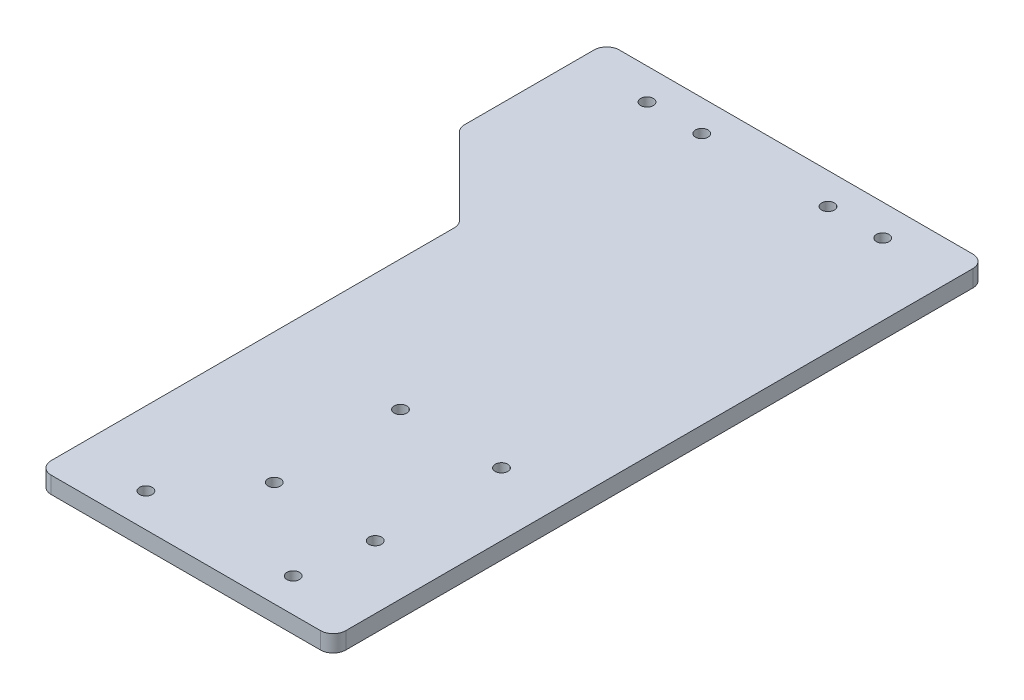
ISO-10303-21;
HEADER;
FILE_DESCRIPTION(('STEP AP214'),'2;1');
FILE_NAME('part.step','',(''),(''),'','','');
FILE_SCHEMA(('AUTOMOTIVE_DESIGN { 1 0 10303 214 1 1 1 1 }'));
ENDSEC;
DATA;
#1=APPLICATION_CONTEXT('core data for automotive mechanical design processes');
#2=APPLICATION_PROTOCOL_DEFINITION('international standard','automotive_design',2000,#1);
#3=PRODUCT_CONTEXT('',#1,'mechanical');
#4=PRODUCT('Part','Part','',(#3));
#5=PRODUCT_RELATED_PRODUCT_CATEGORY('part','',(#4));
#6=PRODUCT_DEFINITION_FORMATION('','',#4);
#7=PRODUCT_DEFINITION_CONTEXT('part definition',#1,'design');
#8=PRODUCT_DEFINITION('design','',#6,#7);
#9=PRODUCT_DEFINITION_SHAPE('','',#8);
#10=(LENGTH_UNIT() NAMED_UNIT(*) SI_UNIT(.MILLI.,.METRE.));
#11=(NAMED_UNIT(*) PLANE_ANGLE_UNIT() SI_UNIT($,.RADIAN.));
#12=(NAMED_UNIT(*) SI_UNIT($,.STERADIAN.) SOLID_ANGLE_UNIT());
#13=UNCERTAINTY_MEASURE_WITH_UNIT(LENGTH_MEASURE(1.E-05),#10,'distance_accuracy_value','');
#14=(GEOMETRIC_REPRESENTATION_CONTEXT(3) GLOBAL_UNCERTAINTY_ASSIGNED_CONTEXT((#13)) GLOBAL_UNIT_ASSIGNED_CONTEXT((#10,
#11,#12)) REPRESENTATION_CONTEXT('',''));
#15=CARTESIAN_POINT('',(0.,0.,0.));
#16=DIRECTION('',(0.,0.,1.));
#17=DIRECTION('',(1.,0.,0.));
#18=AXIS2_PLACEMENT_3D('',#15,#16,#17);
#19=CARTESIAN_POINT('',(0.,4.,0.));
#20=DIRECTION('',(0.,0.,-1.));
#21=DIRECTION('',(-1.,0.,0.));
#22=AXIS2_PLACEMENT_3D('',#19,#20,#21);
#23=PLANE('',#22);
#24=DIRECTION('',(1.,0.,0.));
#25=VECTOR('',#24,1.);
#26=CARTESIAN_POINT('',(0.,0.,0.));
#27=LINE('',#26,#25);
#28=CARTESIAN_POINT('',(-7.,0.,0.));
#29=VERTEX_POINT('',#28);
#30=CARTESIAN_POINT('',(57.,0.,0.));
#31=VERTEX_POINT('',#30);
#32=EDGE_CURVE('E152',#29,#31,#27,.T.);
#33=ORIENTED_EDGE('',*,*,#32,.T.);
#34=DIRECTION('',(0.,-1.,0.));
#35=VECTOR('',#34,1.);
#36=CARTESIAN_POINT('',(57.,4.,0.));
#37=LINE('',#36,#35);
#38=CARTESIAN_POINT('',(57.,4.,0.));
#39=VERTEX_POINT('',#38);
#40=EDGE_CURVE('E129',#31,#39,#37,.F.);
#41=ORIENTED_EDGE('',*,*,#40,.T.);
#42=DIRECTION('',(1.,0.,0.));
#43=VECTOR('',#42,1.);
#44=CARTESIAN_POINT('',(0.,4.,0.));
#45=LINE('',#44,#43);
#46=CARTESIAN_POINT('',(-7.,4.,0.));
#47=VERTEX_POINT('',#46);
#48=EDGE_CURVE('E166',#47,#39,#45,.T.);
#49=ORIENTED_EDGE('',*,*,#48,.F.);
#50=DIRECTION('',(0.,1.,0.));
#51=VECTOR('',#50,1.);
#52=CARTESIAN_POINT('',(-7.,0.,0.));
#53=LINE('',#52,#51);
#54=EDGE_CURVE('E134',#47,#29,#53,.F.);
#55=ORIENTED_EDGE('',*,*,#54,.T.);
#56=EDGE_LOOP('',(#33,#41,#49,#55));
#57=FACE_BOUND('',#56,.T.);
#58=ADVANCED_FACE('F34',(#57),#23,.F.);
#59=CARTESIAN_POINT('',(60.,4.,0.));
#60=DIRECTION('',(-1.,0.,0.));
#61=DIRECTION('',(0.,0.,1.));
#62=AXIS2_PLACEMENT_3D('',#59,#60,#61);
#63=PLANE('',#62);
#64=DIRECTION('',(0.,0.,-1.));
#65=VECTOR('',#64,1.);
#66=CARTESIAN_POINT('',(60.,4.,0.));
#67=LINE('',#66,#65);
#68=CARTESIAN_POINT('',(60.,4.,-3.));
#69=VERTEX_POINT('',#68);
#70=CARTESIAN_POINT('',(60.,4.,-152.));
#71=VERTEX_POINT('',#70);
#72=EDGE_CURVE('E144',#69,#71,#67,.T.);
#73=ORIENTED_EDGE('',*,*,#72,.F.);
#74=DIRECTION('',(0.,-1.,0.));
#75=VECTOR('',#74,1.);
#76=CARTESIAN_POINT('',(60.,4.,-3.));
#77=LINE('',#76,#75);
#78=CARTESIAN_POINT('',(60.,0.,-3.));
#79=VERTEX_POINT('',#78);
#80=EDGE_CURVE('E128',#69,#79,#77,.T.);
#81=ORIENTED_EDGE('',*,*,#80,.T.);
#82=DIRECTION('',(0.,0.,-1.));
#83=VECTOR('',#82,1.);
#84=CARTESIAN_POINT('',(60.,0.,0.));
#85=LINE('',#84,#83);
#86=CARTESIAN_POINT('',(60.,0.,-152.));
#87=VERTEX_POINT('',#86);
#88=EDGE_CURVE('E141',#79,#87,#85,.T.);
#89=ORIENTED_EDGE('',*,*,#88,.T.);
#90=DIRECTION('',(0.,-1.,0.));
#91=VECTOR('',#90,1.);
#92=CARTESIAN_POINT('',(60.,4.,-152.));
#93=LINE('',#92,#91);
#94=EDGE_CURVE('E146',#87,#71,#93,.F.);
#95=ORIENTED_EDGE('',*,*,#94,.T.);
#96=EDGE_LOOP('',(#73,#81,#89,#95));
#97=FACE_BOUND('',#96,.T.);
#98=ADVANCED_FACE('F140',(#97),#63,.F.);
#99=CARTESIAN_POINT('',(60.,4.,-155.));
#100=DIRECTION('',(0.,0.,1.));
#101=DIRECTION('',(1.,0.,0.));
#102=AXIS2_PLACEMENT_3D('',#99,#100,#101);
#103=PLANE('',#102);
#104=DIRECTION('',(-1.,0.,0.));
#105=VECTOR('',#104,1.);
#106=CARTESIAN_POINT('',(60.,0.,-155.));
#107=LINE('',#106,#105);
#108=CARTESIAN_POINT('',(57.,0.,-155.));
#109=VERTEX_POINT('',#108);
#110=CARTESIAN_POINT('',(-27.,0.,-155.));
#111=VERTEX_POINT('',#110);
#112=EDGE_CURVE('E151',#109,#111,#107,.T.);
#113=ORIENTED_EDGE('',*,*,#112,.T.);
#114=DIRECTION('',(0.,-1.,0.));
#115=VECTOR('',#114,1.);
#116=CARTESIAN_POINT('',(-27.,4.,-155.));
#117=LINE('',#116,#115);
#118=CARTESIAN_POINT('',(-27.,4.,-155.));
#119=VERTEX_POINT('',#118);
#120=EDGE_CURVE('E204',#111,#119,#117,.F.);
#121=ORIENTED_EDGE('',*,*,#120,.T.);
#122=DIRECTION('',(-1.,0.,0.));
#123=VECTOR('',#122,1.);
#124=CARTESIAN_POINT('',(60.,4.,-155.));
#125=LINE('',#124,#123);
#126=CARTESIAN_POINT('',(57.,4.,-155.));
#127=VERTEX_POINT('',#126);
#128=EDGE_CURVE('E243',#127,#119,#125,.T.);
#129=ORIENTED_EDGE('',*,*,#128,.F.);
#130=DIRECTION('',(0.,-1.,0.));
#131=VECTOR('',#130,1.);
#132=CARTESIAN_POINT('',(57.,4.,-155.));
#133=LINE('',#132,#131);
#134=EDGE_CURVE('E201',#127,#109,#133,.T.);
#135=ORIENTED_EDGE('',*,*,#134,.T.);
#136=EDGE_LOOP('',(#113,#121,#129,#135));
#137=FACE_BOUND('',#136,.T.);
#138=ADVANCED_FACE('F239',(#137),#103,.F.);
#139=CARTESIAN_POINT('',(-30.,4.,-120.));
#140=DIRECTION('',(1.,0.,0.));
#141=DIRECTION('',(0.,0.,-1.));
#142=AXIS2_PLACEMENT_3D('',#139,#140,#141);
#143=PLANE('',#142);
#144=DIRECTION('',(0.,0.,1.));
#145=VECTOR('',#144,1.);
#146=CARTESIAN_POINT('',(-30.,0.,-120.));
#147=LINE('',#146,#145);
#148=CARTESIAN_POINT('',(-30.,0.,-152.));
#149=VERTEX_POINT('',#148);
#150=CARTESIAN_POINT('',(-30.,0.,-121.242640687119));
#151=VERTEX_POINT('',#150);
#152=EDGE_CURVE('E155',#149,#151,#147,.T.);
#153=ORIENTED_EDGE('',*,*,#152,.T.);
#154=DIRECTION('',(0.,-1.,0.));
#155=VECTOR('',#154,1.);
#156=CARTESIAN_POINT('',(-30.,4.,-121.242640687119));
#157=LINE('',#156,#155);
#158=CARTESIAN_POINT('',(-30.,4.,-121.242640687119));
#159=VERTEX_POINT('',#158);
#160=EDGE_CURVE('E199',#151,#159,#157,.F.);
#161=ORIENTED_EDGE('',*,*,#160,.T.);
#162=DIRECTION('',(0.,0.,1.));
#163=VECTOR('',#162,1.);
#164=CARTESIAN_POINT('',(-30.,4.,-120.));
#165=LINE('',#164,#163);
#166=CARTESIAN_POINT('',(-30.,4.,-152.));
#167=VERTEX_POINT('',#166);
#168=EDGE_CURVE('E233',#167,#159,#165,.T.);
#169=ORIENTED_EDGE('',*,*,#168,.F.);
#170=DIRECTION('',(0.,-1.,0.));
#171=VECTOR('',#170,1.);
#172=CARTESIAN_POINT('',(-30.,4.,-152.));
#173=LINE('',#172,#171);
#174=EDGE_CURVE('E196',#167,#149,#173,.T.);
#175=ORIENTED_EDGE('',*,*,#174,.T.);
#176=EDGE_LOOP('',(#153,#161,#169,#175));
#177=FACE_BOUND('',#176,.T.);
#178=ADVANCED_FACE('F230',(#177),#143,.F.);
#179=CARTESIAN_POINT('',(0.,4.,-90.));
#180=DIRECTION('',(0.707106781186544,0.,-0.707106781186551));
#181=DIRECTION('',(-0.707106781186551,0.,-0.707106781186544));
#182=AXIS2_PLACEMENT_3D('',#179,#180,#181);
#183=PLANE('',#182);
#184=DIRECTION('',(0.707106781186551,0.,0.707106781186544));
#185=VECTOR('',#184,1.);
#186=CARTESIAN_POINT('',(0.,0.,-90.));
#187=LINE('',#186,#185);
#188=CARTESIAN_POINT('',(-29.1213203435596,0.,-119.121320343559));
#189=VERTEX_POINT('',#188);
#190=CARTESIAN_POINT('',(-10.8786796564404,0.,-100.87867965644));
#191=VERTEX_POINT('',#190);
#192=EDGE_CURVE('E163',#189,#191,#187,.T.);
#193=ORIENTED_EDGE('',*,*,#192,.T.);
#194=DIRECTION('',(0.,1.,0.));
#195=VECTOR('',#194,1.);
#196=CARTESIAN_POINT('',(-10.8786796564404,4.,-100.87867965644));
#197=LINE('',#196,#195);
#198=CARTESIAN_POINT('',(-10.8786796564404,4.,-100.87867965644));
#199=VERTEX_POINT('',#198);
#200=EDGE_CURVE('E194',#191,#199,#197,.T.);
#201=ORIENTED_EDGE('',*,*,#200,.T.);
#202=DIRECTION('',(0.707106781186551,0.,0.707106781186544));
#203=VECTOR('',#202,1.);
#204=CARTESIAN_POINT('',(0.,4.,-90.));
#205=LINE('',#204,#203);
#206=CARTESIAN_POINT('',(-29.1213203435596,4.,-119.121320343559));
#207=VERTEX_POINT('',#206);
#208=EDGE_CURVE('E167',#207,#199,#205,.T.);
#209=ORIENTED_EDGE('',*,*,#208,.F.);
#210=DIRECTION('',(0.,-1.,0.));
#211=VECTOR('',#210,1.);
#212=CARTESIAN_POINT('',(-29.1213203435596,4.,-119.121320343559));
#213=LINE('',#212,#211);
#214=EDGE_CURVE('E191',#207,#189,#213,.T.);
#215=ORIENTED_EDGE('',*,*,#214,.T.);
#216=EDGE_LOOP('',(#193,#201,#209,#215));
#217=FACE_BOUND('',#216,.T.);
#218=ADVANCED_FACE('F223',(#217),#183,.F.);
#219=CARTESIAN_POINT('',(0.,4.,0.));
#220=DIRECTION('',(0.,1.,0.));
#221=DIRECTION('',(0.,0.,1.));
#222=AXIS2_PLACEMENT_3D('',#219,#220,#221);
#223=PLANE('',#222);
#224=CARTESIAN_POINT('',(42.5,4.,-8.));
#225=DIRECTION('',(0.,1.,0.));
#226=DIRECTION('',(0.,0.,1.));
#227=AXIS2_PLACEMENT_3D('',#224,#225,#226);
#228=CIRCLE('',#227,1.5);
#229=CARTESIAN_POINT('',(42.5,4.,-6.5));
#230=VERTEX_POINT('',#229);
#231=EDGE_CURVE('E305',#230,#230,#228,.T.);
#232=ORIENTED_EDGE('',*,*,#231,.F.);
#233=EDGE_LOOP('',(#232));
#234=FACE_BOUND('',#233,.T.);
#235=CARTESIAN_POINT('',(7.49999999999999,4.,-8.));
#236=DIRECTION('',(0.,1.,0.));
#237=DIRECTION('',(0.,0.,1.));
#238=AXIS2_PLACEMENT_3D('',#235,#236,#237);
#239=CIRCLE('',#238,1.5);
#240=CARTESIAN_POINT('',(7.49999999999999,4.,-6.5));
#241=VERTEX_POINT('',#240);
#242=EDGE_CURVE('E299',#241,#241,#239,.T.);
#243=ORIENTED_EDGE('',*,*,#242,.F.);
#244=EDGE_LOOP('',(#243));
#245=FACE_BOUND('',#244,.T.);
#246=ORIENTED_EDGE('',*,*,#48,.T.);
#247=CARTESIAN_POINT('',(57.,4.,-3.));
#248=DIRECTION('',(0.,1.,0.));
#249=DIRECTION('',(0.,0.,1.));
#250=AXIS2_PLACEMENT_3D('',#247,#248,#249);
#251=CIRCLE('',#250,3.);
#252=EDGE_CURVE('E184',#39,#69,#251,.T.);
#253=ORIENTED_EDGE('',*,*,#252,.T.);
#254=ORIENTED_EDGE('',*,*,#72,.T.);
#255=CARTESIAN_POINT('',(57.,4.,-152.));
#256=DIRECTION('',(0.,1.,0.));
#257=DIRECTION('',(0.,0.,1.));
#258=AXIS2_PLACEMENT_3D('',#255,#256,#257);
#259=CIRCLE('',#258,3.);
#260=EDGE_CURVE('E177',#71,#127,#259,.T.);
#261=ORIENTED_EDGE('',*,*,#260,.T.);
#262=ORIENTED_EDGE('',*,*,#128,.T.);
#263=CARTESIAN_POINT('',(-27.,4.,-152.));
#264=DIRECTION('',(0.,1.,0.));
#265=DIRECTION('',(0.,0.,1.));
#266=AXIS2_PLACEMENT_3D('',#263,#264,#265);
#267=CIRCLE('',#266,3.);
#268=EDGE_CURVE('E179',#119,#167,#267,.T.);
#269=ORIENTED_EDGE('',*,*,#268,.T.);
#270=ORIENTED_EDGE('',*,*,#168,.T.);
#271=CARTESIAN_POINT('',(-27.,4.,-121.242640687119));
#272=DIRECTION('',(0.,1.,0.));
#273=DIRECTION('',(0.,0.,1.));
#274=AXIS2_PLACEMENT_3D('',#271,#272,#273);
#275=CIRCLE('',#274,3.);
#276=EDGE_CURVE('E56',#159,#207,#275,.T.);
#277=ORIENTED_EDGE('',*,*,#276,.T.);
#278=ORIENTED_EDGE('',*,*,#208,.T.);
#279=CARTESIAN_POINT('',(-13.,4.,-98.7573593128806));
#280=DIRECTION('',(0.,1.,0.));
#281=DIRECTION('',(0.,0.,1.));
#282=AXIS2_PLACEMENT_3D('',#279,#280,#281);
#283=CIRCLE('',#282,3.);
#284=CARTESIAN_POINT('',(-10.,4.,-98.7573593128806));
#285=VERTEX_POINT('',#284);
#286=EDGE_CURVE('E42',#199,#285,#283,.F.);
#287=ORIENTED_EDGE('',*,*,#286,.T.);
#288=DIRECTION('',(0.,0.,1.));
#289=VECTOR('',#288,1.);
#290=CARTESIAN_POINT('',(-10.,4.,0.));
#291=LINE('',#290,#289);
#292=CARTESIAN_POINT('',(-10.,4.,-3.));
#293=VERTEX_POINT('',#292);
#294=EDGE_CURVE('E210',#285,#293,#291,.T.);
#295=ORIENTED_EDGE('',*,*,#294,.T.);
#296=CARTESIAN_POINT('',(-7.,4.,-3.));
#297=DIRECTION('',(0.,1.,0.));
#298=DIRECTION('',(0.,0.,1.));
#299=AXIS2_PLACEMENT_3D('',#296,#297,#298);
#300=CIRCLE('',#299,3.);
#301=EDGE_CURVE('E182',#293,#47,#300,.T.);
#302=ORIENTED_EDGE('',*,*,#301,.T.);
#303=EDGE_LOOP('',(#246,#253,#254,#261,#262,#269,#270,#277,#278,#287,#295,#302));
#304=FACE_BOUND('',#303,.T.);
#305=CARTESIAN_POINT('',(43.,4.,-147.590674679282));
#306=DIRECTION('',(0.,1.,0.));
#307=DIRECTION('',(0.,0.,1.));
#308=AXIS2_PLACEMENT_3D('',#305,#306,#307);
#309=CIRCLE('',#308,1.5);
#310=CARTESIAN_POINT('',(43.,4.,-146.090674679282));
#311=VERTEX_POINT('',#310);
#312=EDGE_CURVE('E293',#311,#311,#309,.T.);
#313=ORIENTED_EDGE('',*,*,#312,.F.);
#314=EDGE_LOOP('',(#313));
#315=FACE_BOUND('',#314,.T.);
#316=CARTESIAN_POINT('',(-13.,4.,-147.590674679282));
#317=DIRECTION('',(0.,1.,0.));
#318=DIRECTION('',(0.,0.,-1.));
#319=AXIS2_PLACEMENT_3D('',#316,#317,#318);
#320=CIRCLE('',#319,1.5);
#321=CARTESIAN_POINT('',(-13.,4.,-149.090674679282));
#322=VERTEX_POINT('',#321);
#323=EDGE_CURVE('E287',#322,#322,#320,.T.);
#324=ORIENTED_EDGE('',*,*,#323,.F.);
#325=EDGE_LOOP('',(#324));
#326=FACE_BOUND('',#325,.T.);
#327=CARTESIAN_POINT('',(0.,4.,-147.590674679282));
#328=DIRECTION('',(0.,1.,0.));
#329=DIRECTION('',(0.,0.,-1.));
#330=AXIS2_PLACEMENT_3D('',#327,#328,#329);
#331=CIRCLE('',#330,1.5);
#332=CARTESIAN_POINT('',(0.,4.,-149.090674679282));
#333=VERTEX_POINT('',#332);
#334=EDGE_CURVE('E281',#333,#333,#331,.T.);
#335=ORIENTED_EDGE('',*,*,#334,.F.);
#336=EDGE_LOOP('',(#335));
#337=FACE_BOUND('',#336,.T.);
#338=CARTESIAN_POINT('',(30.,4.,-147.590674679282));
#339=DIRECTION('',(0.,1.,0.));
#340=DIRECTION('',(0.,0.,1.));
#341=AXIS2_PLACEMENT_3D('',#338,#339,#340);
#342=CIRCLE('',#341,1.5);
#343=CARTESIAN_POINT('',(30.,4.,-146.090674679282));
#344=VERTEX_POINT('',#343);
#345=EDGE_CURVE('E275',#344,#344,#342,.T.);
#346=ORIENTED_EDGE('',*,*,#345,.F.);
#347=EDGE_LOOP('',(#346));
#348=FACE_BOUND('',#347,.T.);
#349=CARTESIAN_POINT('',(21.,4.,-25.));
#350=DIRECTION('',(0.,1.,0.));
#351=DIRECTION('',(0.,0.,1.));
#352=AXIS2_PLACEMENT_3D('',#349,#350,#351);
#353=CIRCLE('',#352,1.5);
#354=CARTESIAN_POINT('',(21.,4.,-23.5));
#355=VERTEX_POINT('',#354);
#356=EDGE_CURVE('E270',#355,#355,#353,.T.);
#357=ORIENTED_EDGE('',*,*,#356,.F.);
#358=EDGE_LOOP('',(#357));
#359=FACE_BOUND('',#358,.T.);
#360=CARTESIAN_POINT('',(45.,4.,-55.));
#361=DIRECTION('',(0.,1.,0.));
#362=DIRECTION('',(0.,0.,1.));
#363=AXIS2_PLACEMENT_3D('',#360,#361,#362);
#364=CIRCLE('',#363,1.5);
#365=CARTESIAN_POINT('',(45.,4.,-53.5));
#366=VERTEX_POINT('',#365);
#367=EDGE_CURVE('E264',#366,#366,#364,.T.);
#368=ORIENTED_EDGE('',*,*,#367,.F.);
#369=EDGE_LOOP('',(#368));
#370=FACE_BOUND('',#369,.T.);
#371=CARTESIAN_POINT('',(21.,4.,-55.));
#372=DIRECTION('',(0.,1.,0.));
#373=DIRECTION('',(0.,0.,1.));
#374=AXIS2_PLACEMENT_3D('',#371,#372,#373);
#375=CIRCLE('',#374,1.5);
#376=CARTESIAN_POINT('',(21.,4.,-53.5));
#377=VERTEX_POINT('',#376);
#378=EDGE_CURVE('E257',#377,#377,#375,.T.);
#379=ORIENTED_EDGE('',*,*,#378,.F.);
#380=EDGE_LOOP('',(#379));
#381=FACE_BOUND('',#380,.T.);
#382=CARTESIAN_POINT('',(45.,4.,-25.));
#383=DIRECTION('',(0.,1.,0.));
#384=DIRECTION('',(0.,0.,1.));
#385=AXIS2_PLACEMENT_3D('',#382,#383,#384);
#386=CIRCLE('',#385,1.5);
#387=CARTESIAN_POINT('',(45.,4.,-23.5));
#388=VERTEX_POINT('',#387);
#389=EDGE_CURVE('E251',#388,#388,#386,.T.);
#390=ORIENTED_EDGE('',*,*,#389,.F.);
#391=EDGE_LOOP('',(#390));
#392=FACE_BOUND('',#391,.T.);
#393=ADVANCED_FACE('F208',(#234,#245,#304,#315,#326,#337,#348,#359,#370,#381,#392),#223,.T.);
#394=CARTESIAN_POINT('',(0.,0.,0.));
#395=DIRECTION('',(0.,1.,0.));
#396=DIRECTION('',(0.,0.,1.));
#397=AXIS2_PLACEMENT_3D('',#394,#395,#396);
#398=PLANE('',#397);
#399=CARTESIAN_POINT('',(42.5,0.,-8.));
#400=DIRECTION('',(0.,1.,0.));
#401=DIRECTION('',(0.,0.,1.));
#402=AXIS2_PLACEMENT_3D('',#399,#400,#401);
#403=CIRCLE('',#402,1.5);
#404=CARTESIAN_POINT('',(42.5,0.,-6.5));
#405=VERTEX_POINT('',#404);
#406=EDGE_CURVE('E302',#405,#405,#403,.T.);
#407=ORIENTED_EDGE('',*,*,#406,.T.);
#408=EDGE_LOOP('',(#407));
#409=FACE_BOUND('',#408,.T.);
#410=CARTESIAN_POINT('',(7.49999999999999,0.,-8.));
#411=DIRECTION('',(0.,1.,0.));
#412=DIRECTION('',(0.,0.,1.));
#413=AXIS2_PLACEMENT_3D('',#410,#411,#412);
#414=CIRCLE('',#413,1.5);
#415=CARTESIAN_POINT('',(7.49999999999999,0.,-6.5));
#416=VERTEX_POINT('',#415);
#417=EDGE_CURVE('E217',#416,#416,#414,.T.);
#418=ORIENTED_EDGE('',*,*,#417,.T.);
#419=EDGE_LOOP('',(#418));
#420=FACE_BOUND('',#419,.T.);
#421=ORIENTED_EDGE('',*,*,#88,.F.);
#422=CARTESIAN_POINT('',(57.,0.,-3.));
#423=DIRECTION('',(0.,1.,0.));
#424=DIRECTION('',(0.,0.,1.));
#425=AXIS2_PLACEMENT_3D('',#422,#423,#424);
#426=CIRCLE('',#425,3.);
#427=EDGE_CURVE('E124',#79,#31,#426,.F.);
#428=ORIENTED_EDGE('',*,*,#427,.T.);
#429=ORIENTED_EDGE('',*,*,#32,.F.);
#430=CARTESIAN_POINT('',(-7.,0.,-3.));
#431=DIRECTION('',(0.,1.,0.));
#432=DIRECTION('',(0.,0.,1.));
#433=AXIS2_PLACEMENT_3D('',#430,#431,#432);
#434=CIRCLE('',#433,3.);
#435=CARTESIAN_POINT('',(-10.,0.,-3.));
#436=VERTEX_POINT('',#435);
#437=EDGE_CURVE('E135',#29,#436,#434,.F.);
#438=ORIENTED_EDGE('',*,*,#437,.T.);
#439=DIRECTION('',(0.,0.,-1.));
#440=VECTOR('',#439,1.);
#441=CARTESIAN_POINT('',(-10.,0.,0.));
#442=LINE('',#441,#440);
#443=CARTESIAN_POINT('',(-10.,0.,-98.7573593128806));
#444=VERTEX_POINT('',#443);
#445=EDGE_CURVE('E216',#436,#444,#442,.T.);
#446=ORIENTED_EDGE('',*,*,#445,.T.);
#447=CARTESIAN_POINT('',(-13.,0.,-98.7573593128806));
#448=DIRECTION('',(0.,1.,0.));
#449=DIRECTION('',(0.,0.,1.));
#450=AXIS2_PLACEMENT_3D('',#447,#448,#449);
#451=CIRCLE('',#450,3.);
#452=EDGE_CURVE('E11',#444,#191,#451,.T.);
#453=ORIENTED_EDGE('',*,*,#452,.T.);
#454=ORIENTED_EDGE('',*,*,#192,.F.);
#455=CARTESIAN_POINT('',(-27.,0.,-121.242640687119));
#456=DIRECTION('',(0.,1.,0.));
#457=DIRECTION('',(0.,0.,1.));
#458=AXIS2_PLACEMENT_3D('',#455,#456,#457);
#459=CIRCLE('',#458,3.);
#460=EDGE_CURVE('E172',#189,#151,#459,.F.);
#461=ORIENTED_EDGE('',*,*,#460,.T.);
#462=ORIENTED_EDGE('',*,*,#152,.F.);
#463=CARTESIAN_POINT('',(-27.,0.,-152.));
#464=DIRECTION('',(0.,1.,0.));
#465=DIRECTION('',(0.,0.,1.));
#466=AXIS2_PLACEMENT_3D('',#463,#464,#465);
#467=CIRCLE('',#466,3.);
#468=EDGE_CURVE('E170',#149,#111,#467,.F.);
#469=ORIENTED_EDGE('',*,*,#468,.T.);
#470=ORIENTED_EDGE('',*,*,#112,.F.);
#471=CARTESIAN_POINT('',(57.,0.,-152.));
#472=DIRECTION('',(0.,1.,0.));
#473=DIRECTION('',(0.,0.,1.));
#474=AXIS2_PLACEMENT_3D('',#471,#472,#473);
#475=CIRCLE('',#474,3.);
#476=EDGE_CURVE('E145',#109,#87,#475,.F.);
#477=ORIENTED_EDGE('',*,*,#476,.T.);
#478=EDGE_LOOP('',(#421,#428,#429,#438,#446,#453,#454,#461,#462,#469,#470,#477));
#479=FACE_BOUND('',#478,.T.);
#480=CARTESIAN_POINT('',(43.,0.,-147.590674679282));
#481=DIRECTION('',(0.,1.,0.));
#482=DIRECTION('',(0.,0.,1.));
#483=AXIS2_PLACEMENT_3D('',#480,#481,#482);
#484=CIRCLE('',#483,1.5);
#485=CARTESIAN_POINT('',(43.,0.,-146.090674679282));
#486=VERTEX_POINT('',#485);
#487=EDGE_CURVE('E278',#486,#486,#484,.T.);
#488=ORIENTED_EDGE('',*,*,#487,.T.);
#489=EDGE_LOOP('',(#488));
#490=FACE_BOUND('',#489,.T.);
#491=CARTESIAN_POINT('',(-13.,0.,-147.590674679282));
#492=DIRECTION('',(0.,1.,0.));
#493=DIRECTION('',(0.,0.,-1.));
#494=AXIS2_PLACEMENT_3D('',#491,#492,#493);
#495=CIRCLE('',#494,1.5);
#496=CARTESIAN_POINT('',(-13.,0.,-149.090674679282));
#497=VERTEX_POINT('',#496);
#498=EDGE_CURVE('E290',#497,#497,#495,.T.);
#499=ORIENTED_EDGE('',*,*,#498,.T.);
#500=EDGE_LOOP('',(#499));
#501=FACE_BOUND('',#500,.T.);
#502=CARTESIAN_POINT('',(0.,0.,-147.590674679282));
#503=DIRECTION('',(0.,1.,0.));
#504=DIRECTION('',(0.,0.,-1.));
#505=AXIS2_PLACEMENT_3D('',#502,#503,#504);
#506=CIRCLE('',#505,1.5);
#507=CARTESIAN_POINT('',(0.,0.,-149.090674679282));
#508=VERTEX_POINT('',#507);
#509=EDGE_CURVE('E284',#508,#508,#506,.T.);
#510=ORIENTED_EDGE('',*,*,#509,.T.);
#511=EDGE_LOOP('',(#510));
#512=FACE_BOUND('',#511,.T.);
#513=CARTESIAN_POINT('',(30.,0.,-147.590674679282));
#514=DIRECTION('',(0.,1.,0.));
#515=DIRECTION('',(0.,0.,1.));
#516=AXIS2_PLACEMENT_3D('',#513,#514,#515);
#517=CIRCLE('',#516,1.5);
#518=CARTESIAN_POINT('',(30.,0.,-146.090674679282));
#519=VERTEX_POINT('',#518);
#520=EDGE_CURVE('E261',#519,#519,#517,.T.);
#521=ORIENTED_EDGE('',*,*,#520,.T.);
#522=EDGE_LOOP('',(#521));
#523=FACE_BOUND('',#522,.T.);
#524=CARTESIAN_POINT('',(21.,0.,-25.));
#525=DIRECTION('',(0.,1.,0.));
#526=DIRECTION('',(0.,0.,1.));
#527=AXIS2_PLACEMENT_3D('',#524,#525,#526);
#528=CIRCLE('',#527,1.5);
#529=CARTESIAN_POINT('',(21.,0.,-23.5));
#530=VERTEX_POINT('',#529);
#531=EDGE_CURVE('E254',#530,#530,#528,.T.);
#532=ORIENTED_EDGE('',*,*,#531,.T.);
#533=EDGE_LOOP('',(#532));
#534=FACE_BOUND('',#533,.T.);
#535=CARTESIAN_POINT('',(45.,0.,-55.));
#536=DIRECTION('',(0.,1.,0.));
#537=DIRECTION('',(0.,0.,1.));
#538=AXIS2_PLACEMENT_3D('',#535,#536,#537);
#539=CIRCLE('',#538,1.5);
#540=CARTESIAN_POINT('',(45.,0.,-53.5));
#541=VERTEX_POINT('',#540);
#542=EDGE_CURVE('E267',#541,#541,#539,.T.);
#543=ORIENTED_EDGE('',*,*,#542,.T.);
#544=EDGE_LOOP('',(#543));
#545=FACE_BOUND('',#544,.T.);
#546=CARTESIAN_POINT('',(21.,0.,-55.));
#547=DIRECTION('',(0.,1.,0.));
#548=DIRECTION('',(0.,0.,1.));
#549=AXIS2_PLACEMENT_3D('',#546,#547,#548);
#550=CIRCLE('',#549,1.5);
#551=CARTESIAN_POINT('',(21.,0.,-53.5));
#552=VERTEX_POINT('',#551);
#553=EDGE_CURVE('E260',#552,#552,#550,.T.);
#554=ORIENTED_EDGE('',*,*,#553,.T.);
#555=EDGE_LOOP('',(#554));
#556=FACE_BOUND('',#555,.T.);
#557=CARTESIAN_POINT('',(45.,0.,-25.));
#558=DIRECTION('',(0.,1.,0.));
#559=DIRECTION('',(0.,0.,1.));
#560=AXIS2_PLACEMENT_3D('',#557,#558,#559);
#561=CIRCLE('',#560,1.5);
#562=CARTESIAN_POINT('',(45.,0.,-23.5));
#563=VERTEX_POINT('',#562);
#564=EDGE_CURVE('E157',#563,#563,#561,.T.);
#565=ORIENTED_EDGE('',*,*,#564,.T.);
#566=EDGE_LOOP('',(#565));
#567=FACE_BOUND('',#566,.T.);
#568=ADVANCED_FACE('F148',(#409,#420,#479,#490,#501,#512,#523,#534,#545,#556,#567),#398,.F.);
#569=CARTESIAN_POINT('',(45.,0.,-25.));
#570=DIRECTION('',(0.,1.,0.));
#571=DIRECTION('',(0.,0.,1.));
#572=AXIS2_PLACEMENT_3D('',#569,#570,#571);
#573=CYLINDRICAL_SURFACE('',#572,1.5);
#574=ORIENTED_EDGE('',*,*,#564,.F.);
#575=EDGE_LOOP('',(#574));
#576=FACE_BOUND('',#575,.T.);
#577=ORIENTED_EDGE('',*,*,#389,.T.);
#578=EDGE_LOOP('',(#577));
#579=FACE_BOUND('',#578,.T.);
#580=ADVANCED_FACE('F378',(#576,#579),#573,.F.);
#581=CARTESIAN_POINT('',(21.,0.,-55.));
#582=DIRECTION('',(0.,1.,0.));
#583=DIRECTION('',(0.,0.,1.));
#584=AXIS2_PLACEMENT_3D('',#581,#582,#583);
#585=CYLINDRICAL_SURFACE('',#584,1.5);
#586=ORIENTED_EDGE('',*,*,#553,.F.);
#587=EDGE_LOOP('',(#586));
#588=FACE_BOUND('',#587,.T.);
#589=ORIENTED_EDGE('',*,*,#378,.T.);
#590=EDGE_LOOP('',(#589));
#591=FACE_BOUND('',#590,.T.);
#592=ADVANCED_FACE('F398',(#588,#591),#585,.F.);
#593=CARTESIAN_POINT('',(45.,0.,-55.));
#594=DIRECTION('',(0.,1.,0.));
#595=DIRECTION('',(0.,0.,1.));
#596=AXIS2_PLACEMENT_3D('',#593,#594,#595);
#597=CYLINDRICAL_SURFACE('',#596,1.5);
#598=ORIENTED_EDGE('',*,*,#542,.F.);
#599=EDGE_LOOP('',(#598));
#600=FACE_BOUND('',#599,.T.);
#601=ORIENTED_EDGE('',*,*,#367,.T.);
#602=EDGE_LOOP('',(#601));
#603=FACE_BOUND('',#602,.T.);
#604=ADVANCED_FACE('F406',(#600,#603),#597,.F.);
#605=CARTESIAN_POINT('',(21.,0.,-25.));
#606=DIRECTION('',(0.,1.,0.));
#607=DIRECTION('',(0.,0.,1.));
#608=AXIS2_PLACEMENT_3D('',#605,#606,#607);
#609=CYLINDRICAL_SURFACE('',#608,1.5);
#610=ORIENTED_EDGE('',*,*,#531,.F.);
#611=EDGE_LOOP('',(#610));
#612=FACE_BOUND('',#611,.T.);
#613=ORIENTED_EDGE('',*,*,#356,.T.);
#614=EDGE_LOOP('',(#613));
#615=FACE_BOUND('',#614,.T.);
#616=ADVANCED_FACE('F414',(#612,#615),#609,.F.);
#617=CARTESIAN_POINT('',(30.,0.,-147.590674679282));
#618=DIRECTION('',(0.,1.,0.));
#619=DIRECTION('',(0.,0.,1.));
#620=AXIS2_PLACEMENT_3D('',#617,#618,#619);
#621=CYLINDRICAL_SURFACE('',#620,1.5);
#622=ORIENTED_EDGE('',*,*,#520,.F.);
#623=EDGE_LOOP('',(#622));
#624=FACE_BOUND('',#623,.T.);
#625=ORIENTED_EDGE('',*,*,#345,.T.);
#626=EDGE_LOOP('',(#625));
#627=FACE_BOUND('',#626,.T.);
#628=ADVANCED_FACE('F422',(#624,#627),#621,.F.);
#629=CARTESIAN_POINT('',(0.,0.,-147.590674679282));
#630=DIRECTION('',(0.,1.,0.));
#631=DIRECTION('',(0.,0.,1.));
#632=AXIS2_PLACEMENT_3D('',#629,#630,#631);
#633=CYLINDRICAL_SURFACE('',#632,1.5);
#634=ORIENTED_EDGE('',*,*,#509,.F.);
#635=EDGE_LOOP('',(#634));
#636=FACE_BOUND('',#635,.T.);
#637=ORIENTED_EDGE('',*,*,#334,.T.);
#638=EDGE_LOOP('',(#637));
#639=FACE_BOUND('',#638,.T.);
#640=ADVANCED_FACE('F430',(#636,#639),#633,.F.);
#641=CARTESIAN_POINT('',(-13.,0.,-147.590674679282));
#642=DIRECTION('',(0.,1.,0.));
#643=DIRECTION('',(0.,0.,1.));
#644=AXIS2_PLACEMENT_3D('',#641,#642,#643);
#645=CYLINDRICAL_SURFACE('',#644,1.5);
#646=ORIENTED_EDGE('',*,*,#498,.F.);
#647=EDGE_LOOP('',(#646));
#648=FACE_BOUND('',#647,.T.);
#649=ORIENTED_EDGE('',*,*,#323,.T.);
#650=EDGE_LOOP('',(#649));
#651=FACE_BOUND('',#650,.T.);
#652=ADVANCED_FACE('F438',(#648,#651),#645,.F.);
#653=CARTESIAN_POINT('',(43.,0.,-147.590674679282));
#654=DIRECTION('',(0.,1.,0.));
#655=DIRECTION('',(0.,0.,1.));
#656=AXIS2_PLACEMENT_3D('',#653,#654,#655);
#657=CYLINDRICAL_SURFACE('',#656,1.5);
#658=ORIENTED_EDGE('',*,*,#487,.F.);
#659=EDGE_LOOP('',(#658));
#660=FACE_BOUND('',#659,.T.);
#661=ORIENTED_EDGE('',*,*,#312,.T.);
#662=EDGE_LOOP('',(#661));
#663=FACE_BOUND('',#662,.T.);
#664=ADVANCED_FACE('F446',(#660,#663),#657,.F.);
#665=CARTESIAN_POINT('',(-10.,-100.498756211209,0.));
#666=DIRECTION('',(-1.,0.,0.));
#667=DIRECTION('',(0.,0.,1.));
#668=AXIS2_PLACEMENT_3D('',#665,#666,#667);
#669=PLANE('',#668);
#670=ORIENTED_EDGE('',*,*,#445,.F.);
#671=DIRECTION('',(0.,1.,0.));
#672=VECTOR('',#671,1.);
#673=CARTESIAN_POINT('',(-10.,4.,-3.));
#674=LINE('',#673,#672);
#675=EDGE_CURVE('E188',#436,#293,#674,.T.);
#676=ORIENTED_EDGE('',*,*,#675,.T.);
#677=ORIENTED_EDGE('',*,*,#294,.F.);
#678=DIRECTION('',(0.,1.,0.));
#679=VECTOR('',#678,1.);
#680=CARTESIAN_POINT('',(-10.,-100.498756211209,-98.7573593128806));
#681=LINE('',#680,#679);
#682=EDGE_CURVE('E186',#285,#444,#681,.F.);
#683=ORIENTED_EDGE('',*,*,#682,.T.);
#684=EDGE_LOOP('',(#670,#676,#677,#683));
#685=FACE_BOUND('',#684,.T.);
#686=ADVANCED_FACE('F213',(#685),#669,.T.);
#687=CARTESIAN_POINT('',(57.,4.,-3.));
#688=DIRECTION('',(0.,-1.,0.));
#689=DIRECTION('',(0.,0.,-1.));
#690=AXIS2_PLACEMENT_3D('',#687,#688,#689);
#691=CYLINDRICAL_SURFACE('',#690,3.);
#692=ORIENTED_EDGE('',*,*,#252,.F.);
#693=ORIENTED_EDGE('',*,*,#40,.F.);
#694=ORIENTED_EDGE('',*,*,#427,.F.);
#695=ORIENTED_EDGE('',*,*,#80,.F.);
#696=EDGE_LOOP('',(#692,#693,#694,#695));
#697=FACE_BOUND('',#696,.T.);
#698=ADVANCED_FACE('F127',(#697),#691,.T.);
#699=CARTESIAN_POINT('',(-7.,-100.498756211209,-3.));
#700=DIRECTION('',(0.,-1.,0.));
#701=DIRECTION('',(0.,0.,-1.));
#702=AXIS2_PLACEMENT_3D('',#699,#700,#701);
#703=CYLINDRICAL_SURFACE('',#702,3.);
#704=ORIENTED_EDGE('',*,*,#437,.F.);
#705=ORIENTED_EDGE('',*,*,#54,.F.);
#706=ORIENTED_EDGE('',*,*,#301,.F.);
#707=ORIENTED_EDGE('',*,*,#675,.F.);
#708=EDGE_LOOP('',(#704,#705,#706,#707));
#709=FACE_BOUND('',#708,.T.);
#710=ADVANCED_FACE('F344',(#709),#703,.T.);
#711=CARTESIAN_POINT('',(-13.,4.,-98.7573593128806));
#712=DIRECTION('',(0.,1.,0.));
#713=DIRECTION('',(0.,0.,1.));
#714=AXIS2_PLACEMENT_3D('',#711,#712,#713);
#715=CYLINDRICAL_SURFACE('',#714,3.);
#716=ORIENTED_EDGE('',*,*,#452,.F.);
#717=ORIENTED_EDGE('',*,*,#682,.F.);
#718=ORIENTED_EDGE('',*,*,#286,.F.);
#719=ORIENTED_EDGE('',*,*,#200,.F.);
#720=EDGE_LOOP('',(#716,#717,#718,#719));
#721=FACE_BOUND('',#720,.T.);
#722=ADVANCED_FACE('F220',(#721),#715,.F.);
#723=CARTESIAN_POINT('',(-27.,4.,-121.242640687119));
#724=DIRECTION('',(0.,-1.,0.));
#725=DIRECTION('',(0.,0.,-1.));
#726=AXIS2_PLACEMENT_3D('',#723,#724,#725);
#727=CYLINDRICAL_SURFACE('',#726,3.);
#728=ORIENTED_EDGE('',*,*,#276,.F.);
#729=ORIENTED_EDGE('',*,*,#160,.F.);
#730=ORIENTED_EDGE('',*,*,#460,.F.);
#731=ORIENTED_EDGE('',*,*,#214,.F.);
#732=EDGE_LOOP('',(#728,#729,#730,#731));
#733=FACE_BOUND('',#732,.T.);
#734=ADVANCED_FACE('F226',(#733),#727,.T.);
#735=CARTESIAN_POINT('',(-27.,4.,-152.));
#736=DIRECTION('',(0.,-1.,0.));
#737=DIRECTION('',(0.,0.,-1.));
#738=AXIS2_PLACEMENT_3D('',#735,#736,#737);
#739=CYLINDRICAL_SURFACE('',#738,3.);
#740=ORIENTED_EDGE('',*,*,#268,.F.);
#741=ORIENTED_EDGE('',*,*,#120,.F.);
#742=ORIENTED_EDGE('',*,*,#468,.F.);
#743=ORIENTED_EDGE('',*,*,#174,.F.);
#744=EDGE_LOOP('',(#740,#741,#742,#743));
#745=FACE_BOUND('',#744,.T.);
#746=ADVANCED_FACE('F236',(#745),#739,.T.);
#747=CARTESIAN_POINT('',(57.,4.,-152.));
#748=DIRECTION('',(0.,-1.,0.));
#749=DIRECTION('',(0.,0.,-1.));
#750=AXIS2_PLACEMENT_3D('',#747,#748,#749);
#751=CYLINDRICAL_SURFACE('',#750,3.);
#752=ORIENTED_EDGE('',*,*,#260,.F.);
#753=ORIENTED_EDGE('',*,*,#94,.F.);
#754=ORIENTED_EDGE('',*,*,#476,.F.);
#755=ORIENTED_EDGE('',*,*,#134,.F.);
#756=EDGE_LOOP('',(#752,#753,#754,#755));
#757=FACE_BOUND('',#756,.T.);
#758=ADVANCED_FACE('F36',(#757),#751,.T.);
#759=CARTESIAN_POINT('',(7.49999999999999,0.,-8.));
#760=DIRECTION('',(0.,1.,0.));
#761=DIRECTION('',(0.,0.,1.));
#762=AXIS2_PLACEMENT_3D('',#759,#760,#761);
#763=CYLINDRICAL_SURFACE('',#762,1.5);
#764=ORIENTED_EDGE('',*,*,#417,.F.);
#765=EDGE_LOOP('',(#764));
#766=FACE_BOUND('',#765,.T.);
#767=ORIENTED_EDGE('',*,*,#242,.T.);
#768=EDGE_LOOP('',(#767));
#769=FACE_BOUND('',#768,.T.);
#770=ADVANCED_FACE('F316',(#766,#769),#763,.F.);
#771=CARTESIAN_POINT('',(42.5,0.,-8.));
#772=DIRECTION('',(0.,1.,0.));
#773=DIRECTION('',(0.,0.,1.));
#774=AXIS2_PLACEMENT_3D('',#771,#772,#773);
#775=CYLINDRICAL_SURFACE('',#774,1.5);
#776=ORIENTED_EDGE('',*,*,#406,.F.);
#777=EDGE_LOOP('',(#776));
#778=FACE_BOUND('',#777,.T.);
#779=ORIENTED_EDGE('',*,*,#231,.T.);
#780=EDGE_LOOP('',(#779));
#781=FACE_BOUND('',#780,.T.);
#782=ADVANCED_FACE('F313',(#778,#781),#775,.F.);
#783=CLOSED_SHELL('',(#58,#98,#138,#178,#218,#393,#568,#580,#592,#604,#616,#628,#640,#652,#664,
#686,#698,#710,#722,#734,#746,#758,#770,#782));
#784=MANIFOLD_SOLID_BREP('B2',#783);
#785=ADVANCED_BREP_SHAPE_REPRESENTATION('',(#18,#784),#14);
#786=SHAPE_DEFINITION_REPRESENTATION(#9,#785);
ENDSEC;
END-ISO-10303-21;
